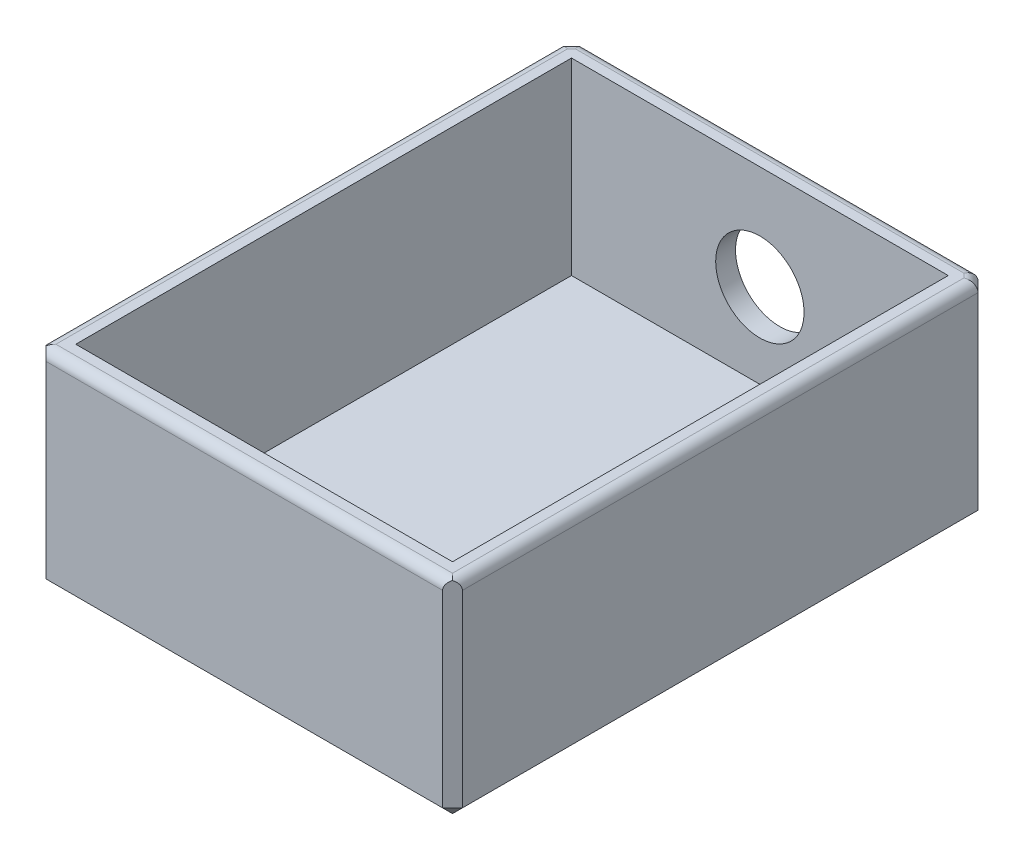
ISO-10303-21;
HEADER;
FILE_DESCRIPTION(('STEP AP214'),'2;1');
FILE_NAME('part.step','',(''),(''),'','','');
FILE_SCHEMA(('AUTOMOTIVE_DESIGN { 1 0 10303 214 1 1 1 1 }'));
ENDSEC;
DATA;
#1=APPLICATION_CONTEXT('core data for automotive mechanical design processes');
#2=APPLICATION_PROTOCOL_DEFINITION('international standard','automotive_design',2000,#1);
#3=PRODUCT_CONTEXT('',#1,'mechanical');
#4=PRODUCT('Part','Part','',(#3));
#5=PRODUCT_RELATED_PRODUCT_CATEGORY('part','',(#4));
#6=PRODUCT_DEFINITION_FORMATION('','',#4);
#7=PRODUCT_DEFINITION_CONTEXT('part definition',#1,'design');
#8=PRODUCT_DEFINITION('design','',#6,#7);
#9=PRODUCT_DEFINITION_SHAPE('','',#8);
#10=(LENGTH_UNIT() NAMED_UNIT(*) SI_UNIT(.MILLI.,.METRE.));
#11=(NAMED_UNIT(*) PLANE_ANGLE_UNIT() SI_UNIT($,.RADIAN.));
#12=(NAMED_UNIT(*) SI_UNIT($,.STERADIAN.) SOLID_ANGLE_UNIT());
#13=UNCERTAINTY_MEASURE_WITH_UNIT(LENGTH_MEASURE(1.E-05),#10,'distance_accuracy_value','');
#14=(GEOMETRIC_REPRESENTATION_CONTEXT(3) GLOBAL_UNCERTAINTY_ASSIGNED_CONTEXT((#13)) GLOBAL_UNIT_ASSIGNED_CONTEXT((#10,
#11,#12)) REPRESENTATION_CONTEXT('',''));
#15=CARTESIAN_POINT('',(0.,0.,0.));
#16=DIRECTION('',(0.,0.,1.));
#17=DIRECTION('',(1.,0.,0.));
#18=AXIS2_PLACEMENT_3D('',#15,#16,#17);
#19=CARTESIAN_POINT('',(0.,2.,50.));
#20=DIRECTION('',(0.,1.,0.));
#21=DIRECTION('',(0.,0.,1.));
#22=AXIS2_PLACEMENT_3D('',#19,#20,#21);
#23=PLANE('',#22);
#24=DIRECTION('',(1.,0.,0.));
#25=VECTOR('',#24,1.);
#26=CARTESIAN_POINT('',(0.,2.,0.));
#27=LINE('',#26,#25);
#28=CARTESIAN_POINT('',(2.,2.,0.));
#29=VERTEX_POINT('',#28);
#30=CARTESIAN_POINT('',(40.,2.,0.));
#31=VERTEX_POINT('',#30);
#32=EDGE_CURVE('E492',#29,#31,#27,.T.);
#33=ORIENTED_EDGE('',*,*,#32,.F.);
#34=DIRECTION('',(0.,0.,-1.));
#35=VECTOR('',#34,1.);
#36=CARTESIAN_POINT('',(2.,2.,50.));
#37=LINE('',#36,#35);
#38=CARTESIAN_POINT('',(2.,2.,50.));
#39=VERTEX_POINT('',#38);
#40=EDGE_CURVE('E199',#39,#29,#37,.T.);
#41=ORIENTED_EDGE('',*,*,#40,.F.);
#42=DIRECTION('',(1.,0.,0.));
#43=VECTOR('',#42,1.);
#44=CARTESIAN_POINT('',(0.,2.,50.));
#45=LINE('',#44,#43);
#46=CARTESIAN_POINT('',(40.,2.,50.));
#47=VERTEX_POINT('',#46);
#48=EDGE_CURVE('E175',#39,#47,#45,.T.);
#49=ORIENTED_EDGE('',*,*,#48,.T.);
#50=DIRECTION('',(0.,0.,-1.));
#51=VECTOR('',#50,1.);
#52=CARTESIAN_POINT('',(40.,2.,50.));
#53=LINE('',#52,#51);
#54=EDGE_CURVE('E205',#47,#31,#53,.T.);
#55=ORIENTED_EDGE('',*,*,#54,.T.);
#56=EDGE_LOOP('',(#33,#41,#49,#55));
#57=FACE_BOUND('',#56,.T.);
#58=ADVANCED_FACE('F42',(#57),#23,.T.);
#59=CARTESIAN_POINT('',(2.,0.,50.));
#60=DIRECTION('',(-1.,0.,0.));
#61=DIRECTION('',(0.,0.,1.));
#62=AXIS2_PLACEMENT_3D('',#59,#60,#61);
#63=PLANE('',#62);
#64=DIRECTION('',(0.,1.,0.));
#65=VECTOR('',#64,1.);
#66=CARTESIAN_POINT('',(2.,0.,0.));
#67=LINE('',#66,#65);
#68=CARTESIAN_POINT('',(2.,21.,0.));
#69=VERTEX_POINT('',#68);
#70=EDGE_CURVE('E197',#29,#69,#67,.T.);
#71=ORIENTED_EDGE('',*,*,#70,.T.);
#72=DIRECTION('',(0.,0.,-1.));
#73=VECTOR('',#72,1.);
#74=CARTESIAN_POINT('',(2.,21.,50.));
#75=LINE('',#74,#73);
#76=CARTESIAN_POINT('',(2.,21.,50.));
#77=VERTEX_POINT('',#76);
#78=EDGE_CURVE('E187',#77,#69,#75,.T.);
#79=ORIENTED_EDGE('',*,*,#78,.F.);
#80=DIRECTION('',(0.,1.,0.));
#81=VECTOR('',#80,1.);
#82=CARTESIAN_POINT('',(2.,0.,50.));
#83=LINE('',#82,#81);
#84=EDGE_CURVE('E169',#39,#77,#83,.T.);
#85=ORIENTED_EDGE('',*,*,#84,.F.);
#86=ORIENTED_EDGE('',*,*,#40,.T.);
#87=EDGE_LOOP('',(#71,#79,#85,#86));
#88=FACE_BOUND('',#87,.T.);
#89=ADVANCED_FACE('F196',(#88),#63,.F.);
#90=CARTESIAN_POINT('',(0.,0.,50.));
#91=DIRECTION('',(-1.,0.,0.));
#92=DIRECTION('',(0.,0.,1.));
#93=AXIS2_PLACEMENT_3D('',#90,#91,#92);
#94=PLANE('',#93);
#95=DIRECTION('',(0.,1.,0.));
#96=VECTOR('',#95,1.);
#97=CARTESIAN_POINT('',(0.,21.,51.));
#98=LINE('',#97,#96);
#99=CARTESIAN_POINT('',(0.,1.00000000000001,51.));
#100=VERTEX_POINT('',#99);
#101=CARTESIAN_POINT('',(0.,20.,51.));
#102=VERTEX_POINT('',#101);
#103=EDGE_CURVE('E220',#100,#102,#98,.T.);
#104=ORIENTED_EDGE('',*,*,#103,.T.);
#105=DIRECTION('',(0.,0.,-1.));
#106=VECTOR('',#105,1.);
#107=CARTESIAN_POINT('',(0.,20.,50.));
#108=LINE('',#107,#106);
#109=CARTESIAN_POINT('',(0.,20.,-1.));
#110=VERTEX_POINT('',#109);
#111=EDGE_CURVE('E344',#102,#110,#108,.T.);
#112=ORIENTED_EDGE('',*,*,#111,.T.);
#113=DIRECTION('',(0.,-1.,0.));
#114=VECTOR('',#113,1.);
#115=CARTESIAN_POINT('',(0.,0.,-1.));
#116=LINE('',#115,#114);
#117=CARTESIAN_POINT('',(0.,1.00000000000001,-1.));
#118=VERTEX_POINT('',#117);
#119=EDGE_CURVE('E224',#110,#118,#116,.T.);
#120=ORIENTED_EDGE('',*,*,#119,.T.);
#121=DIRECTION('',(0.,0.,1.));
#122=VECTOR('',#121,1.);
#123=CARTESIAN_POINT('',(0.,1.00000000000001,52.));
#124=LINE('',#123,#122);
#125=EDGE_CURVE('E217',#118,#100,#124,.T.);
#126=ORIENTED_EDGE('',*,*,#125,.T.);
#127=EDGE_LOOP('',(#104,#112,#120,#126));
#128=FACE_BOUND('',#127,.T.);
#129=ADVANCED_FACE('F441',(#128),#94,.T.);
#130=CARTESIAN_POINT('',(0.,0.,50.));
#131=DIRECTION('',(0.,1.,0.));
#132=DIRECTION('',(0.,0.,1.));
#133=AXIS2_PLACEMENT_3D('',#130,#131,#132);
#134=PLANE('',#133);
#135=DIRECTION('',(0.,0.,1.));
#136=VECTOR('',#135,1.);
#137=CARTESIAN_POINT('',(41.,0.,50.));
#138=LINE('',#137,#136);
#139=CARTESIAN_POINT('',(41.,0.,-1.));
#140=VERTEX_POINT('',#139);
#141=CARTESIAN_POINT('',(41.,0.,51.));
#142=VERTEX_POINT('',#141);
#143=EDGE_CURVE('E253',#140,#142,#138,.T.);
#144=ORIENTED_EDGE('',*,*,#143,.T.);
#145=DIRECTION('',(-1.,0.,0.));
#146=VECTOR('',#145,1.);
#147=CARTESIAN_POINT('',(0.,0.,51.));
#148=LINE('',#147,#146);
#149=CARTESIAN_POINT('',(1.,0.,51.));
#150=VERTEX_POINT('',#149);
#151=EDGE_CURVE('E256',#142,#150,#148,.T.);
#152=ORIENTED_EDGE('',*,*,#151,.T.);
#153=DIRECTION('',(0.,0.,-1.));
#154=VECTOR('',#153,1.);
#155=CARTESIAN_POINT('',(1.,0.,-2.));
#156=LINE('',#155,#154);
#157=CARTESIAN_POINT('',(1.,0.,-1.));
#158=VERTEX_POINT('',#157);
#159=EDGE_CURVE('E250',#150,#158,#156,.T.);
#160=ORIENTED_EDGE('',*,*,#159,.T.);
#161=DIRECTION('',(1.,0.,0.));
#162=VECTOR('',#161,1.);
#163=CARTESIAN_POINT('',(42.,0.,-1.));
#164=LINE('',#163,#162);
#165=EDGE_CURVE('E247',#158,#140,#164,.T.);
#166=ORIENTED_EDGE('',*,*,#165,.T.);
#167=EDGE_LOOP('',(#144,#152,#160,#166));
#168=FACE_BOUND('',#167,.T.);
#169=ADVANCED_FACE('F447',(#168),#134,.F.);
#170=CARTESIAN_POINT('',(42.,0.,50.));
#171=DIRECTION('',(-1.,0.,0.));
#172=DIRECTION('',(0.,0.,1.));
#173=AXIS2_PLACEMENT_3D('',#170,#171,#172);
#174=PLANE('',#173);
#175=DIRECTION('',(0.,1.,0.));
#176=VECTOR('',#175,1.);
#177=CARTESIAN_POINT('',(42.,21.,-1.));
#178=LINE('',#177,#176);
#179=CARTESIAN_POINT('',(42.,1.00000000000001,-1.));
#180=VERTEX_POINT('',#179);
#181=CARTESIAN_POINT('',(42.,20.,-1.));
#182=VERTEX_POINT('',#181);
#183=EDGE_CURVE('E243',#180,#182,#178,.T.);
#184=ORIENTED_EDGE('',*,*,#183,.T.);
#185=DIRECTION('',(0.,0.,-1.));
#186=VECTOR('',#185,1.);
#187=CARTESIAN_POINT('',(42.,20.,51.));
#188=LINE('',#187,#186);
#189=CARTESIAN_POINT('',(42.,20.,51.));
#190=VERTEX_POINT('',#189);
#191=EDGE_CURVE('E347',#182,#190,#188,.F.);
#192=ORIENTED_EDGE('',*,*,#191,.T.);
#193=DIRECTION('',(0.,-1.,0.));
#194=VECTOR('',#193,1.);
#195=CARTESIAN_POINT('',(42.,0.,51.));
#196=LINE('',#195,#194);
#197=CARTESIAN_POINT('',(42.,1.00000000000001,51.));
#198=VERTEX_POINT('',#197);
#199=EDGE_CURVE('E240',#190,#198,#196,.T.);
#200=ORIENTED_EDGE('',*,*,#199,.T.);
#201=DIRECTION('',(0.,0.,-1.));
#202=VECTOR('',#201,1.);
#203=CARTESIAN_POINT('',(42.,1.00000000000001,50.));
#204=LINE('',#203,#202);
#205=EDGE_CURVE('E237',#198,#180,#204,.T.);
#206=ORIENTED_EDGE('',*,*,#205,.T.);
#207=EDGE_LOOP('',(#184,#192,#200,#206));
#208=FACE_BOUND('',#207,.T.);
#209=ADVANCED_FACE('F396',(#208),#174,.F.);
#210=CARTESIAN_POINT('',(0.,21.,50.));
#211=DIRECTION('',(0.,1.,0.));
#212=DIRECTION('',(0.,0.,1.));
#213=AXIS2_PLACEMENT_3D('',#210,#211,#212);
#214=PLANE('',#213);
#215=DIRECTION('',(0.707106781186551,0.,-0.707106781186544));
#216=VECTOR('',#215,1.);
#217=CARTESIAN_POINT('',(-24.7928932188135,21.,25.2071067811863));
#218=LINE('',#217,#216);
#219=CARTESIAN_POINT('',(1.4142135623731,21.,-1.));
#220=VERTEX_POINT('',#219);
#221=CARTESIAN_POINT('',(1.,21.,-0.585786437626901));
#222=VERTEX_POINT('',#221);
#223=EDGE_CURVE('E332',#220,#222,#218,.F.);
#224=ORIENTED_EDGE('',*,*,#223,.T.);
#225=DIRECTION('',(0.,0.,-1.));
#226=VECTOR('',#225,1.);
#227=CARTESIAN_POINT('',(1.,21.,50.));
#228=LINE('',#227,#226);
#229=CARTESIAN_POINT('',(1.,21.,51.));
#230=VERTEX_POINT('',#229);
#231=EDGE_CURVE('E335',#222,#230,#228,.F.);
#232=ORIENTED_EDGE('',*,*,#231,.T.);
#233=DIRECTION('',(-1.,0.,0.));
#234=VECTOR('',#233,1.);
#235=CARTESIAN_POINT('',(41.,21.,51.));
#236=LINE('',#235,#234);
#237=CARTESIAN_POINT('',(41.,21.,51.));
#238=VERTEX_POINT('',#237);
#239=EDGE_CURVE('E328',#230,#238,#236,.F.);
#240=ORIENTED_EDGE('',*,*,#239,.T.);
#241=DIRECTION('',(0.,0.,-1.));
#242=VECTOR('',#241,1.);
#243=CARTESIAN_POINT('',(41.,21.,-1.));
#244=LINE('',#243,#242);
#245=CARTESIAN_POINT('',(41.,21.,-0.585786437626901));
#246=VERTEX_POINT('',#245);
#247=EDGE_CURVE('E325',#238,#246,#244,.T.);
#248=ORIENTED_EDGE('',*,*,#247,.T.);
#249=DIRECTION('',(-0.707106781186551,0.,-0.707106781186544));
#250=VECTOR('',#249,1.);
#251=CARTESIAN_POINT('',(45.7928932188133,21.,4.20710678118633));
#252=LINE('',#251,#250);
#253=CARTESIAN_POINT('',(40.5857864376269,21.,-1.));
#254=VERTEX_POINT('',#253);
#255=EDGE_CURVE('E319',#246,#254,#252,.T.);
#256=ORIENTED_EDGE('',*,*,#255,.T.);
#257=DIRECTION('',(1.,0.,0.));
#258=VECTOR('',#257,1.);
#259=CARTESIAN_POINT('',(0.,21.,-1.));
#260=LINE('',#259,#258);
#261=EDGE_CURVE('E322',#254,#220,#260,.F.);
#262=ORIENTED_EDGE('',*,*,#261,.T.);
#263=EDGE_LOOP('',(#224,#232,#240,#248,#256,#262));
#264=FACE_BOUND('',#263,.T.);
#265=DIRECTION('',(-1.,0.,0.));
#266=VECTOR('',#265,1.);
#267=CARTESIAN_POINT('',(0.,21.,50.));
#268=LINE('',#267,#266);
#269=CARTESIAN_POINT('',(40.,21.,50.));
#270=VERTEX_POINT('',#269);
#271=EDGE_CURVE('E172',#270,#77,#268,.T.);
#272=ORIENTED_EDGE('',*,*,#271,.T.);
#273=ORIENTED_EDGE('',*,*,#78,.T.);
#274=DIRECTION('',(1.,0.,0.));
#275=VECTOR('',#274,1.);
#276=CARTESIAN_POINT('',(0.,21.,0.));
#277=LINE('',#276,#275);
#278=CARTESIAN_POINT('',(40.,21.,0.));
#279=VERTEX_POINT('',#278);
#280=EDGE_CURVE('E193',#69,#279,#277,.T.);
#281=ORIENTED_EDGE('',*,*,#280,.T.);
#282=DIRECTION('',(0.,0.,-1.));
#283=VECTOR('',#282,1.);
#284=CARTESIAN_POINT('',(40.,21.,50.));
#285=LINE('',#284,#283);
#286=EDGE_CURVE('E190',#270,#279,#285,.T.);
#287=ORIENTED_EDGE('',*,*,#286,.F.);
#288=EDGE_LOOP('',(#272,#273,#281,#287));
#289=FACE_BOUND('',#288,.T.);
#290=ADVANCED_FACE('F185',(#264,#289),#214,.T.);
#291=CARTESIAN_POINT('',(40.,0.,50.));
#292=DIRECTION('',(-1.,0.,0.));
#293=DIRECTION('',(0.,0.,1.));
#294=AXIS2_PLACEMENT_3D('',#291,#292,#293);
#295=PLANE('',#294);
#296=DIRECTION('',(0.,1.,0.));
#297=VECTOR('',#296,1.);
#298=CARTESIAN_POINT('',(40.,0.,0.));
#299=LINE('',#298,#297);
#300=EDGE_CURVE('E494',#31,#279,#299,.T.);
#301=ORIENTED_EDGE('',*,*,#300,.F.);
#302=ORIENTED_EDGE('',*,*,#54,.F.);
#303=DIRECTION('',(0.,1.,0.));
#304=VECTOR('',#303,1.);
#305=CARTESIAN_POINT('',(40.,0.,50.));
#306=LINE('',#305,#304);
#307=EDGE_CURVE('E181',#47,#270,#306,.T.);
#308=ORIENTED_EDGE('',*,*,#307,.T.);
#309=ORIENTED_EDGE('',*,*,#286,.T.);
#310=EDGE_LOOP('',(#301,#302,#308,#309));
#311=FACE_BOUND('',#310,.T.);
#312=ADVANCED_FACE('F456',(#311),#295,.T.);
#313=CARTESIAN_POINT('',(0.,0.,0.));
#314=DIRECTION('',(0.,0.,-1.));
#315=DIRECTION('',(-1.,0.,0.));
#316=AXIS2_PLACEMENT_3D('',#313,#314,#315);
#317=PLANE('',#316);
#318=CARTESIAN_POINT('',(21.,10.5,0.));
#319=DIRECTION('',(0.,0.,-1.));
#320=DIRECTION('',(-1.,0.,0.));
#321=AXIS2_PLACEMENT_3D('',#318,#319,#320);
#322=CIRCLE('',#321,4.45807666745232);
#323=CARTESIAN_POINT('',(16.5419233325477,10.5,0.));
#324=VERTEX_POINT('',#323);
#325=EDGE_CURVE('E194',#324,#324,#322,.T.);
#326=ORIENTED_EDGE('',*,*,#325,.T.);
#327=EDGE_LOOP('',(#326));
#328=FACE_BOUND('',#327,.T.);
#329=ORIENTED_EDGE('',*,*,#32,.T.);
#330=ORIENTED_EDGE('',*,*,#300,.T.);
#331=ORIENTED_EDGE('',*,*,#280,.F.);
#332=ORIENTED_EDGE('',*,*,#70,.F.);
#333=EDGE_LOOP('',(#329,#330,#331,#332));
#334=FACE_BOUND('',#333,.T.);
#335=ADVANCED_FACE('F459',(#328,#334),#317,.F.);
#336=CARTESIAN_POINT('',(0.,0.,-2.));
#337=DIRECTION('',(0.,0.,-1.));
#338=DIRECTION('',(-1.,0.,0.));
#339=AXIS2_PLACEMENT_3D('',#336,#337,#338);
#340=PLANE('',#339);
#341=CARTESIAN_POINT('',(21.,10.5,-2.));
#342=DIRECTION('',(0.,0.,-1.));
#343=DIRECTION('',(-1.,0.,0.));
#344=AXIS2_PLACEMENT_3D('',#341,#342,#343);
#345=CIRCLE('',#344,4.45807666745232);
#346=CARTESIAN_POINT('',(16.5419233325477,10.5,-2.));
#347=VERTEX_POINT('',#346);
#348=EDGE_CURVE('E309',#347,#347,#345,.T.);
#349=ORIENTED_EDGE('',*,*,#348,.F.);
#350=EDGE_LOOP('',(#349));
#351=FACE_BOUND('',#350,.T.);
#352=DIRECTION('',(0.,1.,0.));
#353=VECTOR('',#352,1.);
#354=CARTESIAN_POINT('',(1.00000000000001,0.,-2.));
#355=LINE('',#354,#353);
#356=CARTESIAN_POINT('',(1.00000000000001,1.00000000000001,-2.));
#357=VERTEX_POINT('',#356);
#358=CARTESIAN_POINT('',(1.00000000000001,20.,-2.));
#359=VERTEX_POINT('',#358);
#360=EDGE_CURVE('E214',#357,#359,#355,.T.);
#361=ORIENTED_EDGE('',*,*,#360,.T.);
#362=DIRECTION('',(1.,0.,0.));
#363=VECTOR('',#362,1.);
#364=CARTESIAN_POINT('',(0.,20.,-2.));
#365=LINE('',#364,#363);
#366=CARTESIAN_POINT('',(41.,20.,-2.));
#367=VERTEX_POINT('',#366);
#368=EDGE_CURVE('E60',#359,#367,#365,.T.);
#369=ORIENTED_EDGE('',*,*,#368,.T.);
#370=DIRECTION('',(0.,-1.,0.));
#371=VECTOR('',#370,1.);
#372=CARTESIAN_POINT('',(41.,0.,-2.));
#373=LINE('',#372,#371);
#374=CARTESIAN_POINT('',(41.,1.00000000000001,-2.));
#375=VERTEX_POINT('',#374);
#376=EDGE_CURVE('E211',#367,#375,#373,.T.);
#377=ORIENTED_EDGE('',*,*,#376,.T.);
#378=DIRECTION('',(-1.,0.,0.));
#379=VECTOR('',#378,1.);
#380=CARTESIAN_POINT('',(0.,1.00000000000001,-2.));
#381=LINE('',#380,#379);
#382=EDGE_CURVE('E203',#375,#357,#381,.T.);
#383=ORIENTED_EDGE('',*,*,#382,.T.);
#384=EDGE_LOOP('',(#361,#369,#377,#383));
#385=FACE_BOUND('',#384,.T.);
#386=ADVANCED_FACE('F416',(#351,#385),#340,.T.);
#387=CARTESIAN_POINT('',(0.,0.,52.));
#388=DIRECTION('',(0.,0.,-1.));
#389=DIRECTION('',(-1.,0.,0.));
#390=AXIS2_PLACEMENT_3D('',#387,#388,#389);
#391=PLANE('',#390);
#392=DIRECTION('',(0.,1.,0.));
#393=VECTOR('',#392,1.);
#394=CARTESIAN_POINT('',(41.,0.,52.));
#395=LINE('',#394,#393);
#396=CARTESIAN_POINT('',(41.,1.00000000000001,52.));
#397=VERTEX_POINT('',#396);
#398=CARTESIAN_POINT('',(41.,20.,52.));
#399=VERTEX_POINT('',#398);
#400=EDGE_CURVE('E230',#397,#399,#395,.T.);
#401=ORIENTED_EDGE('',*,*,#400,.T.);
#402=DIRECTION('',(-1.,0.,0.));
#403=VECTOR('',#402,1.);
#404=CARTESIAN_POINT('',(1.,20.,52.));
#405=LINE('',#404,#403);
#406=CARTESIAN_POINT('',(1.,20.,52.));
#407=VERTEX_POINT('',#406);
#408=EDGE_CURVE('E260',#399,#407,#405,.T.);
#409=ORIENTED_EDGE('',*,*,#408,.T.);
#410=DIRECTION('',(0.,-1.,0.));
#411=VECTOR('',#410,1.);
#412=CARTESIAN_POINT('',(1.,0.,52.));
#413=LINE('',#412,#411);
#414=CARTESIAN_POINT('',(1.,1.00000000000001,52.));
#415=VERTEX_POINT('',#414);
#416=EDGE_CURVE('E234',#407,#415,#413,.T.);
#417=ORIENTED_EDGE('',*,*,#416,.T.);
#418=DIRECTION('',(1.,0.,0.));
#419=VECTOR('',#418,1.);
#420=CARTESIAN_POINT('',(0.,1.00000000000001,52.));
#421=LINE('',#420,#419);
#422=EDGE_CURVE('E227',#415,#397,#421,.T.);
#423=ORIENTED_EDGE('',*,*,#422,.T.);
#424=EDGE_LOOP('',(#401,#409,#417,#423));
#425=FACE_BOUND('',#424,.T.);
#426=ADVANCED_FACE('F466',(#425),#391,.F.);
#427=CARTESIAN_POINT('',(0.,0.,50.));
#428=DIRECTION('',(0.,0.,-1.));
#429=DIRECTION('',(-1.,0.,0.));
#430=AXIS2_PLACEMENT_3D('',#427,#428,#429);
#431=PLANE('',#430);
#432=ORIENTED_EDGE('',*,*,#48,.F.);
#433=ORIENTED_EDGE('',*,*,#84,.T.);
#434=ORIENTED_EDGE('',*,*,#271,.F.);
#435=ORIENTED_EDGE('',*,*,#307,.F.);
#436=EDGE_LOOP('',(#432,#433,#434,#435));
#437=FACE_BOUND('',#436,.T.);
#438=ADVANCED_FACE('F171',(#437),#431,.T.);
#439=CARTESIAN_POINT('',(21.,10.5,0.));
#440=DIRECTION('',(0.,0.,-1.));
#441=DIRECTION('',(-1.,0.,0.));
#442=AXIS2_PLACEMENT_3D('',#439,#440,#441);
#443=CYLINDRICAL_SURFACE('',#442,4.45807666745232);
#444=ORIENTED_EDGE('',*,*,#325,.F.);
#445=EDGE_LOOP('',(#444));
#446=FACE_BOUND('',#445,.T.);
#447=ORIENTED_EDGE('',*,*,#348,.T.);
#448=EDGE_LOOP('',(#447));
#449=FACE_BOUND('',#448,.T.);
#450=ADVANCED_FACE('F470',(#446,#449),#443,.F.);
#451=CARTESIAN_POINT('',(42.,0.,51.));
#452=DIRECTION('',(-0.707106781186545,0.,-0.70710678118655));
#453=DIRECTION('',(0.,-1.,0.));
#454=AXIS2_PLACEMENT_3D('',#451,#452,#453);
#455=PLANE('',#454);
#456=CARTESIAN_POINT('',(41.,20.,52.));
#457=DIRECTION('',(-0.707106781186545,0.,-0.70710678118655));
#458=DIRECTION('',(-0.70710678118655,0.,0.707106781186545));
#459=AXIS2_PLACEMENT_3D('',#456,#457,#458);
#460=ELLIPSE('',#459,1.41421356237309,1.);
#461=CARTESIAN_POINT('',(41.5,20.8660254037844,51.5));
#462=VERTEX_POINT('',#461);
#463=EDGE_CURVE('E338',#190,#462,#460,.F.);
#464=ORIENTED_EDGE('',*,*,#463,.T.);
#465=CARTESIAN_POINT('',(42.,20.,51.));
#466=DIRECTION('',(-0.707106781186545,0.,-0.70710678118655));
#467=DIRECTION('',(0.70710678118655,0.,-0.707106781186545));
#468=AXIS2_PLACEMENT_3D('',#465,#466,#467);
#469=ELLIPSE('',#468,1.4142135623731,1.);
#470=EDGE_CURVE('E341',#462,#399,#469,.F.);
#471=ORIENTED_EDGE('',*,*,#470,.T.);
#472=ORIENTED_EDGE('',*,*,#400,.F.);
#473=DIRECTION('',(0.70710678118655,0.,-0.707106781186545));
#474=VECTOR('',#473,1.);
#475=CARTESIAN_POINT('',(42.,1.00000000000001,51.));
#476=LINE('',#475,#474);
#477=EDGE_CURVE('E305',#198,#397,#476,.F.);
#478=ORIENTED_EDGE('',*,*,#477,.F.);
#479=ORIENTED_EDGE('',*,*,#199,.F.);
#480=EDGE_LOOP('',(#464,#471,#472,#478,#479));
#481=FACE_BOUND('',#480,.T.);
#482=ADVANCED_FACE('F400',(#481),#455,.F.);
#483=CARTESIAN_POINT('',(42.,1.00000000000001,51.));
#484=DIRECTION('',(0.577350269189626,-0.577350269189622,0.57735026918963));
#485=DIRECTION('',(0.70710678118655,0.,-0.707106781186545));
#486=AXIS2_PLACEMENT_3D('',#483,#484,#485);
#487=PLANE('',#486);
#488=DIRECTION('',(-0.707106781186545,-0.70710678118655,0.));
#489=VECTOR('',#488,1.);
#490=CARTESIAN_POINT('',(42.,1.00000000000001,51.));
#491=LINE('',#490,#489);
#492=EDGE_CURVE('E297',#198,#142,#491,.T.);
#493=ORIENTED_EDGE('',*,*,#492,.F.);
#494=ORIENTED_EDGE('',*,*,#477,.T.);
#495=DIRECTION('',(0.,0.70710678118655,0.707106781186545));
#496=VECTOR('',#495,1.);
#497=CARTESIAN_POINT('',(41.,0.500000000000004,51.5));
#498=LINE('',#497,#496);
#499=EDGE_CURVE('E301',#142,#397,#498,.T.);
#500=ORIENTED_EDGE('',*,*,#499,.F.);
#501=EDGE_LOOP('',(#493,#494,#500));
#502=FACE_BOUND('',#501,.T.);
#503=ADVANCED_FACE('F406',(#502),#487,.T.);
#504=CARTESIAN_POINT('',(1.,0.,52.));
#505=DIRECTION('',(-0.70710678118655,0.,0.707106781186545));
#506=DIRECTION('',(0.,1.,0.));
#507=AXIS2_PLACEMENT_3D('',#504,#505,#506);
#508=PLANE('',#507);
#509=ORIENTED_EDGE('',*,*,#416,.F.);
#510=CARTESIAN_POINT('',(0.,20.,51.));
#511=DIRECTION('',(-0.70710678118655,0.,0.707106781186545));
#512=DIRECTION('',(0.707106781186545,0.,0.70710678118655));
#513=AXIS2_PLACEMENT_3D('',#510,#511,#512);
#514=ELLIPSE('',#513,1.41421356237309,1.);
#515=CARTESIAN_POINT('',(0.500000000000002,20.8660254037844,51.5));
#516=VERTEX_POINT('',#515);
#517=EDGE_CURVE('E316',#407,#516,#514,.T.);
#518=ORIENTED_EDGE('',*,*,#517,.T.);
#519=CARTESIAN_POINT('',(1.,20.,52.));
#520=DIRECTION('',(-0.70710678118655,0.,0.707106781186545));
#521=DIRECTION('',(-0.707106781186545,0.,-0.70710678118655));
#522=AXIS2_PLACEMENT_3D('',#519,#520,#521);
#523=ELLIPSE('',#522,1.4142135623731,1.);
#524=EDGE_CURVE('E313',#516,#102,#523,.T.);
#525=ORIENTED_EDGE('',*,*,#524,.T.);
#526=ORIENTED_EDGE('',*,*,#103,.F.);
#527=DIRECTION('',(-0.707106781186545,0.,-0.70710678118655));
#528=VECTOR('',#527,1.);
#529=CARTESIAN_POINT('',(1.,1.00000000000001,52.));
#530=LINE('',#529,#528);
#531=EDGE_CURVE('E293',#415,#100,#530,.T.);
#532=ORIENTED_EDGE('',*,*,#531,.F.);
#533=EDGE_LOOP('',(#509,#518,#525,#526,#532));
#534=FACE_BOUND('',#533,.T.);
#535=ADVANCED_FACE('F511',(#534),#508,.T.);
#536=CARTESIAN_POINT('',(0.,0.,51.));
#537=DIRECTION('',(0.,0.707106781186545,-0.70710678118655));
#538=DIRECTION('',(-1.,0.,0.));
#539=AXIS2_PLACEMENT_3D('',#536,#537,#538);
#540=PLANE('',#539);
#541=ORIENTED_EDGE('',*,*,#499,.T.);
#542=ORIENTED_EDGE('',*,*,#422,.F.);
#543=DIRECTION('',(0.,-0.70710678118655,-0.707106781186545));
#544=VECTOR('',#543,1.);
#545=CARTESIAN_POINT('',(1.,1.00000000000001,52.));
#546=LINE('',#545,#544);
#547=EDGE_CURVE('E289',#150,#415,#546,.F.);
#548=ORIENTED_EDGE('',*,*,#547,.F.);
#549=ORIENTED_EDGE('',*,*,#151,.F.);
#550=EDGE_LOOP('',(#541,#542,#548,#549));
#551=FACE_BOUND('',#550,.T.);
#552=ADVANCED_FACE('F626',(#551),#540,.F.);
#553=CARTESIAN_POINT('',(42.,1.00000000000001,50.));
#554=DIRECTION('',(-0.70710678118655,0.707106781186545,0.));
#555=DIRECTION('',(0.,0.,-1.));
#556=AXIS2_PLACEMENT_3D('',#553,#554,#555);
#557=PLANE('',#556);
#558=ORIENTED_EDGE('',*,*,#492,.T.);
#559=ORIENTED_EDGE('',*,*,#143,.F.);
#560=DIRECTION('',(0.707106781186545,0.70710678118655,0.));
#561=VECTOR('',#560,1.);
#562=CARTESIAN_POINT('',(41.5,0.500000000000004,-1.));
#563=LINE('',#562,#561);
#564=EDGE_CURVE('E285',#180,#140,#563,.F.);
#565=ORIENTED_EDGE('',*,*,#564,.F.);
#566=ORIENTED_EDGE('',*,*,#205,.F.);
#567=EDGE_LOOP('',(#558,#559,#565,#566));
#568=FACE_BOUND('',#567,.T.);
#569=ADVANCED_FACE('F411',(#568),#557,.F.);
#570=CARTESIAN_POINT('',(42.,0.,-1.));
#571=DIRECTION('',(0.707106781186544,0.,-0.707106781186551));
#572=DIRECTION('',(0.,-1.,0.));
#573=AXIS2_PLACEMENT_3D('',#570,#571,#572);
#574=PLANE('',#573);
#575=ORIENTED_EDGE('',*,*,#376,.F.);
#576=DIRECTION('',(-0.707106781186551,0.,-0.707106781186544));
#577=VECTOR('',#576,1.);
#578=CARTESIAN_POINT('',(42.,20.,-1.));
#579=LINE('',#578,#577);
#580=EDGE_CURVE('E11',#367,#182,#579,.F.);
#581=ORIENTED_EDGE('',*,*,#580,.T.);
#582=ORIENTED_EDGE('',*,*,#183,.F.);
#583=DIRECTION('',(0.707106781186551,0.,0.707106781186544));
#584=VECTOR('',#583,1.);
#585=CARTESIAN_POINT('',(41.,1.00000000000001,-2.));
#586=LINE('',#585,#584);
#587=EDGE_CURVE('E281',#375,#180,#586,.T.);
#588=ORIENTED_EDGE('',*,*,#587,.F.);
#589=EDGE_LOOP('',(#575,#581,#582,#588));
#590=FACE_BOUND('',#589,.T.);
#591=ADVANCED_FACE('F414',(#590),#574,.T.);
#592=CARTESIAN_POINT('',(1.,1.00000000000001,52.));
#593=DIRECTION('',(-0.57735026918963,-0.577350269189622,0.577350269189626));
#594=DIRECTION('',(0.707106781186545,0.,0.70710678118655));
#595=AXIS2_PLACEMENT_3D('',#592,#593,#594);
#596=PLANE('',#595);
#597=ORIENTED_EDGE('',*,*,#547,.T.);
#598=ORIENTED_EDGE('',*,*,#531,.T.);
#599=DIRECTION('',(0.707106781186545,-0.70710678118655,0.));
#600=VECTOR('',#599,1.);
#601=CARTESIAN_POINT('',(0.5,0.500000000000004,51.));
#602=LINE('',#601,#600);
#603=EDGE_CURVE('E277',#150,#100,#602,.F.);
#604=ORIENTED_EDGE('',*,*,#603,.F.);
#605=EDGE_LOOP('',(#597,#598,#604));
#606=FACE_BOUND('',#605,.T.);
#607=ADVANCED_FACE('F602',(#606),#596,.T.);
#608=CARTESIAN_POINT('',(41.,1.00000000000001,-2.));
#609=DIRECTION('',(0.577350269189625,-0.577350269189621,-0.57735026918963));
#610=DIRECTION('',(-0.707106781186551,0.,-0.707106781186544));
#611=AXIS2_PLACEMENT_3D('',#608,#609,#610);
#612=PLANE('',#611);
#613=ORIENTED_EDGE('',*,*,#587,.T.);
#614=ORIENTED_EDGE('',*,*,#564,.T.);
#615=DIRECTION('',(0.,0.707106781186551,-0.707106781186544));
#616=VECTOR('',#615,1.);
#617=CARTESIAN_POINT('',(41.,1.00000000000001,-2.));
#618=LINE('',#617,#616);
#619=EDGE_CURVE('E273',#375,#140,#618,.F.);
#620=ORIENTED_EDGE('',*,*,#619,.F.);
#621=EDGE_LOOP('',(#613,#614,#620));
#622=FACE_BOUND('',#621,.T.);
#623=ADVANCED_FACE('F593',(#622),#612,.T.);
#624=CARTESIAN_POINT('',(1.,0.,50.));
#625=DIRECTION('',(-0.70710678118655,-0.707106781186545,0.));
#626=DIRECTION('',(0.,0.,1.));
#627=AXIS2_PLACEMENT_3D('',#624,#625,#626);
#628=PLANE('',#627);
#629=ORIENTED_EDGE('',*,*,#603,.T.);
#630=ORIENTED_EDGE('',*,*,#125,.F.);
#631=DIRECTION('',(-0.707106781186545,0.70710678118655,0.));
#632=VECTOR('',#631,1.);
#633=CARTESIAN_POINT('',(0.,1.00000000000001,-1.));
#634=LINE('',#633,#632);
#635=EDGE_CURVE('E269',#158,#118,#634,.T.);
#636=ORIENTED_EDGE('',*,*,#635,.F.);
#637=ORIENTED_EDGE('',*,*,#159,.F.);
#638=EDGE_LOOP('',(#629,#630,#636,#637));
#639=FACE_BOUND('',#638,.T.);
#640=ADVANCED_FACE('F585',(#639),#628,.T.);
#641=CARTESIAN_POINT('',(0.,0.,-1.));
#642=DIRECTION('',(0.,-0.707106781186544,-0.707106781186551));
#643=DIRECTION('',(-1.,0.,0.));
#644=AXIS2_PLACEMENT_3D('',#641,#642,#643);
#645=PLANE('',#644);
#646=ORIENTED_EDGE('',*,*,#619,.T.);
#647=ORIENTED_EDGE('',*,*,#165,.F.);
#648=DIRECTION('',(0.,-0.707106781186551,0.707106781186544));
#649=VECTOR('',#648,1.);
#650=CARTESIAN_POINT('',(1.,0.500000000000005,-1.5));
#651=LINE('',#650,#649);
#652=EDGE_CURVE('E265',#357,#158,#651,.T.);
#653=ORIENTED_EDGE('',*,*,#652,.F.);
#654=ORIENTED_EDGE('',*,*,#382,.F.);
#655=EDGE_LOOP('',(#646,#647,#653,#654));
#656=FACE_BOUND('',#655,.T.);
#657=ADVANCED_FACE('F422',(#656),#645,.T.);
#658=CARTESIAN_POINT('',(0.,1.00000000000001,-1.));
#659=DIRECTION('',(-0.577350269189625,-0.577350269189621,-0.57735026918963));
#660=DIRECTION('',(-0.707106781186551,0.,0.707106781186544));
#661=AXIS2_PLACEMENT_3D('',#658,#659,#660);
#662=PLANE('',#661);
#663=ORIENTED_EDGE('',*,*,#652,.T.);
#664=ORIENTED_EDGE('',*,*,#635,.T.);
#665=DIRECTION('',(-0.707106781186551,0.,0.707106781186544));
#666=VECTOR('',#665,1.);
#667=CARTESIAN_POINT('',(0.,1.00000000000001,-1.));
#668=LINE('',#667,#666);
#669=EDGE_CURVE('E261',#357,#118,#668,.T.);
#670=ORIENTED_EDGE('',*,*,#669,.F.);
#671=EDGE_LOOP('',(#663,#664,#670));
#672=FACE_BOUND('',#671,.T.);
#673=ADVANCED_FACE('F425',(#672),#662,.T.);
#674=CARTESIAN_POINT('',(1.00000000000001,0.,-2.));
#675=DIRECTION('',(0.707106781186544,0.,0.707106781186551));
#676=DIRECTION('',(0.,1.,0.));
#677=AXIS2_PLACEMENT_3D('',#674,#675,#676);
#678=PLANE('',#677);
#679=ORIENTED_EDGE('',*,*,#119,.F.);
#680=DIRECTION('',(-0.707106781186551,0.,0.707106781186544));
#681=VECTOR('',#680,1.);
#682=CARTESIAN_POINT('',(1.00000000000001,20.,-2.));
#683=LINE('',#682,#681);
#684=EDGE_CURVE('E52',#110,#359,#683,.F.);
#685=ORIENTED_EDGE('',*,*,#684,.T.);
#686=ORIENTED_EDGE('',*,*,#360,.F.);
#687=ORIENTED_EDGE('',*,*,#669,.T.);
#688=EDGE_LOOP('',(#679,#685,#686,#687));
#689=FACE_BOUND('',#688,.T.);
#690=ADVANCED_FACE('F426',(#689),#678,.F.);
#691=CARTESIAN_POINT('',(0.,20.,-1.));
#692=DIRECTION('',(1.,0.,0.));
#693=DIRECTION('',(0.,0.,-1.));
#694=AXIS2_PLACEMENT_3D('',#691,#692,#693);
#695=CYLINDRICAL_SURFACE('',#694,1.);
#696=CARTESIAN_POINT('',(1.4142135623731,20.,-0.999999999999997));
#697=DIRECTION('',(0.923879532511288,0.,-0.382683432365088));
#698=DIRECTION('',(-0.382683432365088,0.,-0.923879532511288));
#699=AXIS2_PLACEMENT_3D('',#696,#697,#698);
#700=ELLIPSE('',#699,1.08239220029239,1.);
#701=EDGE_CURVE('E368',#220,#359,#700,.F.);
#702=ORIENTED_EDGE('',*,*,#701,.F.);
#703=ORIENTED_EDGE('',*,*,#261,.F.);
#704=CARTESIAN_POINT('',(40.5857864376269,20.,-0.999999999999998));
#705=DIRECTION('',(-0.923879532511288,0.,-0.382683432365088));
#706=DIRECTION('',(0.382683432365088,0.,-0.923879532511288));
#707=AXIS2_PLACEMENT_3D('',#704,#705,#706);
#708=ELLIPSE('',#707,1.08239220029239,1.);
#709=EDGE_CURVE('E46',#367,#254,#708,.F.);
#710=ORIENTED_EDGE('',*,*,#709,.F.);
#711=ORIENTED_EDGE('',*,*,#368,.F.);
#712=EDGE_LOOP('',(#702,#703,#710,#711));
#713=FACE_BOUND('',#712,.T.);
#714=ADVANCED_FACE('F44',(#713),#695,.T.);
#715=CARTESIAN_POINT('',(45.7928932188133,20.,4.20710678118633));
#716=DIRECTION('',(-0.707106781186551,0.,-0.707106781186544));
#717=DIRECTION('',(-0.707106781186544,0.,0.707106781186551));
#718=AXIS2_PLACEMENT_3D('',#715,#716,#717);
#719=CYLINDRICAL_SURFACE('',#718,1.);
#720=ORIENTED_EDGE('',*,*,#709,.T.);
#721=ORIENTED_EDGE('',*,*,#255,.F.);
#722=CARTESIAN_POINT('',(41.,20.,-0.585786437626899));
#723=DIRECTION('',(-0.382683432365092,0.,-0.923879532511286));
#724=DIRECTION('',(-0.923879532511286,0.,0.382683432365092));
#725=AXIS2_PLACEMENT_3D('',#722,#723,#724);
#726=ELLIPSE('',#725,1.0823922002924,1.);
#727=EDGE_CURVE('E365',#182,#246,#726,.F.);
#728=ORIENTED_EDGE('',*,*,#727,.F.);
#729=ORIENTED_EDGE('',*,*,#580,.F.);
#730=EDGE_LOOP('',(#720,#721,#728,#729));
#731=FACE_BOUND('',#730,.T.);
#732=ADVANCED_FACE('F380',(#731),#719,.T.);
#733=CARTESIAN_POINT('',(-24.7928932188135,20.,25.2071067811863));
#734=DIRECTION('',(0.707106781186551,0.,-0.707106781186544));
#735=DIRECTION('',(-0.707106781186544,0.,-0.707106781186551));
#736=AXIS2_PLACEMENT_3D('',#733,#734,#735);
#737=CYLINDRICAL_SURFACE('',#736,1.);
#738=ORIENTED_EDGE('',*,*,#701,.T.);
#739=ORIENTED_EDGE('',*,*,#684,.F.);
#740=CARTESIAN_POINT('',(0.999999999999999,20.,-0.585786437626898));
#741=DIRECTION('',(0.382683432365092,0.,-0.923879532511286));
#742=DIRECTION('',(0.923879532511286,0.,0.382683432365092));
#743=AXIS2_PLACEMENT_3D('',#740,#741,#742);
#744=ELLIPSE('',#743,1.0823922002924,1.);
#745=EDGE_CURVE('E361',#222,#110,#744,.F.);
#746=ORIENTED_EDGE('',*,*,#745,.F.);
#747=ORIENTED_EDGE('',*,*,#223,.F.);
#748=EDGE_LOOP('',(#738,#739,#746,#747));
#749=FACE_BOUND('',#748,.T.);
#750=ADVANCED_FACE('F529',(#749),#737,.T.);
#751=CARTESIAN_POINT('',(41.,20.,50.));
#752=DIRECTION('',(0.,0.,1.));
#753=DIRECTION('',(1.,0.,0.));
#754=AXIS2_PLACEMENT_3D('',#751,#752,#753);
#755=CYLINDRICAL_SURFACE('',#754,1.);
#756=ORIENTED_EDGE('',*,*,#727,.T.);
#757=ORIENTED_EDGE('',*,*,#247,.F.);
#758=CARTESIAN_POINT('',(41.,20.,51.));
#759=DIRECTION('',(-0.707106781186547,0.,0.707106781186547));
#760=DIRECTION('',(0.707106781186547,0.,0.707106781186547));
#761=AXIS2_PLACEMENT_3D('',#758,#759,#760);
#762=ELLIPSE('',#761,1.41421356237309,1.);
#763=EDGE_CURVE('E358',#462,#238,#762,.T.);
#764=ORIENTED_EDGE('',*,*,#763,.F.);
#765=ORIENTED_EDGE('',*,*,#463,.F.);
#766=ORIENTED_EDGE('',*,*,#191,.F.);
#767=EDGE_LOOP('',(#756,#757,#764,#765,#766));
#768=FACE_BOUND('',#767,.T.);
#769=ADVANCED_FACE('F390',(#768),#755,.T.);
#770=CARTESIAN_POINT('',(1.,20.,50.));
#771=DIRECTION('',(0.,0.,-1.));
#772=DIRECTION('',(-1.,0.,0.));
#773=AXIS2_PLACEMENT_3D('',#770,#771,#772);
#774=CYLINDRICAL_SURFACE('',#773,1.);
#775=ORIENTED_EDGE('',*,*,#111,.F.);
#776=ORIENTED_EDGE('',*,*,#524,.F.);
#777=CARTESIAN_POINT('',(1.,20.,51.));
#778=DIRECTION('',(0.707106781186547,0.,0.707106781186547));
#779=DIRECTION('',(0.707106781186547,0.,-0.707106781186547));
#780=AXIS2_PLACEMENT_3D('',#777,#778,#779);
#781=ELLIPSE('',#780,1.41421356237309,1.);
#782=EDGE_CURVE('E354',#230,#516,#781,.T.);
#783=ORIENTED_EDGE('',*,*,#782,.F.);
#784=ORIENTED_EDGE('',*,*,#231,.F.);
#785=ORIENTED_EDGE('',*,*,#745,.T.);
#786=EDGE_LOOP('',(#775,#776,#783,#784,#785));
#787=FACE_BOUND('',#786,.T.);
#788=ADVANCED_FACE('F522',(#787),#774,.T.);
#789=CARTESIAN_POINT('',(0.,20.,51.));
#790=DIRECTION('',(1.,0.,0.));
#791=DIRECTION('',(0.,0.,-1.));
#792=AXIS2_PLACEMENT_3D('',#789,#790,#791);
#793=CYLINDRICAL_SURFACE('',#792,1.);
#794=ORIENTED_EDGE('',*,*,#763,.T.);
#795=ORIENTED_EDGE('',*,*,#239,.F.);
#796=ORIENTED_EDGE('',*,*,#782,.T.);
#797=ORIENTED_EDGE('',*,*,#517,.F.);
#798=ORIENTED_EDGE('',*,*,#408,.F.);
#799=ORIENTED_EDGE('',*,*,#470,.F.);
#800=EDGE_LOOP('',(#794,#795,#796,#797,#798,#799));
#801=FACE_BOUND('',#800,.T.);
#802=ADVANCED_FACE('F519',(#801),#793,.T.);
#803=CLOSED_SHELL('',(#58,#89,#129,#169,#209,#290,#312,#335,#386,#426,#438,#450,#482,#503,#535,
#552,#569,#591,#607,#623,#640,#657,#673,#690,#714,#732,#750,#769,#788,#802));
#804=MANIFOLD_SOLID_BREP('B2',#803);
#805=ADVANCED_BREP_SHAPE_REPRESENTATION('',(#18,#804),#14);
#806=SHAPE_DEFINITION_REPRESENTATION(#9,#805);
ENDSEC;
END-ISO-10303-21;
